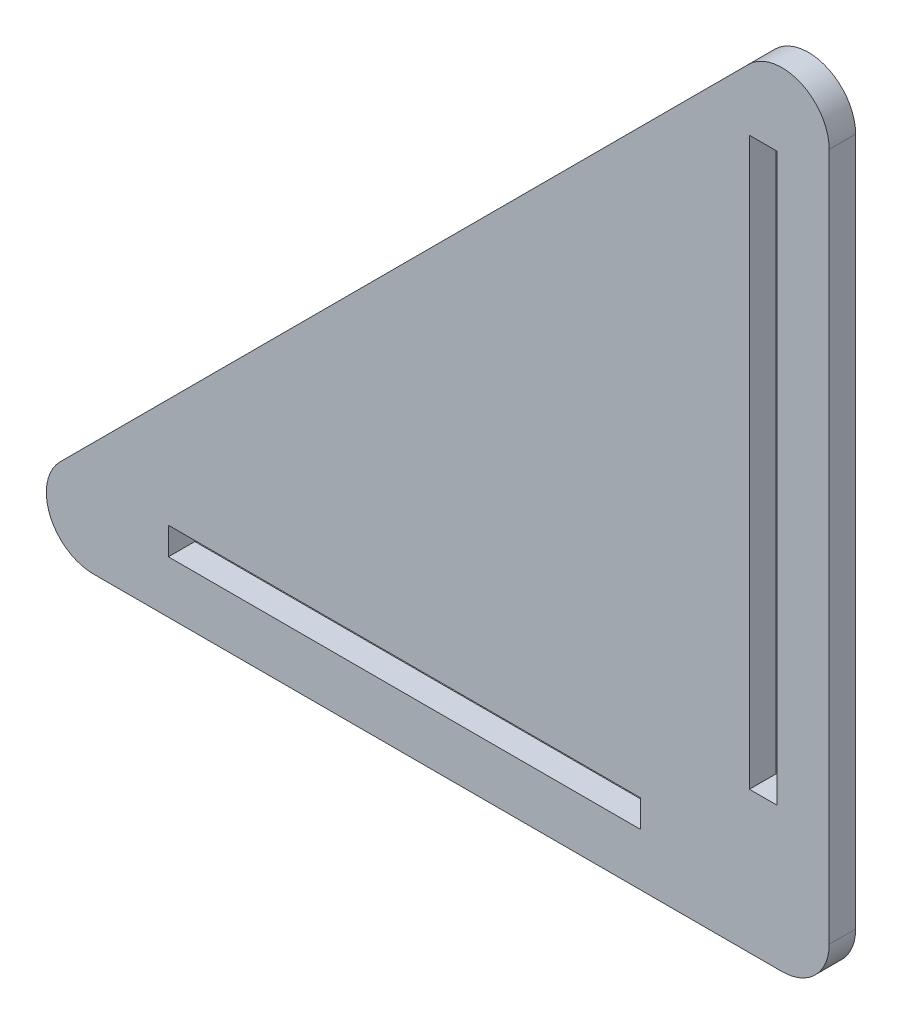
ISO-10303-21;
HEADER;
FILE_DESCRIPTION(('STEP AP214'),'2;1');
FILE_NAME('part.step','',(''),(''),'','','');
FILE_SCHEMA(('AUTOMOTIVE_DESIGN { 1 0 10303 214 1 1 1 1 }'));
ENDSEC;
DATA;
#1=APPLICATION_CONTEXT('core data for automotive mechanical design processes');
#2=APPLICATION_PROTOCOL_DEFINITION('international standard','automotive_design',2000,#1);
#3=PRODUCT_CONTEXT('',#1,'mechanical');
#4=PRODUCT('Part','Part','',(#3));
#5=PRODUCT_RELATED_PRODUCT_CATEGORY('part','',(#4));
#6=PRODUCT_DEFINITION_FORMATION('','',#4);
#7=PRODUCT_DEFINITION_CONTEXT('part definition',#1,'design');
#8=PRODUCT_DEFINITION('design','',#6,#7);
#9=PRODUCT_DEFINITION_SHAPE('','',#8);
#10=(LENGTH_UNIT() NAMED_UNIT(*) SI_UNIT(.MILLI.,.METRE.));
#11=(NAMED_UNIT(*) PLANE_ANGLE_UNIT() SI_UNIT($,.RADIAN.));
#12=(NAMED_UNIT(*) SI_UNIT($,.STERADIAN.) SOLID_ANGLE_UNIT());
#13=UNCERTAINTY_MEASURE_WITH_UNIT(LENGTH_MEASURE(1.E-05),#10,'distance_accuracy_value','');
#14=(GEOMETRIC_REPRESENTATION_CONTEXT(3) GLOBAL_UNCERTAINTY_ASSIGNED_CONTEXT((#13)) GLOBAL_UNIT_ASSIGNED_CONTEXT((#10,
#11,#12)) REPRESENTATION_CONTEXT('',''));
#15=CARTESIAN_POINT('',(0.,0.,0.));
#16=DIRECTION('',(0.,0.,1.));
#17=DIRECTION('',(1.,0.,0.));
#18=AXIS2_PLACEMENT_3D('',#15,#16,#17);
#19=CARTESIAN_POINT('',(40.,-40.,1.4));
#20=DIRECTION('',(0.,0.,1.));
#21=DIRECTION('',(1.,0.,0.));
#22=AXIS2_PLACEMENT_3D('',#19,#20,#21);
#23=PLANE('',#22);
#24=CARTESIAN_POINT('',(40.,-40.,1.4));
#25=DIRECTION('',(0.,0.,1.));
#26=DIRECTION('',(1.,0.,0.));
#27=AXIS2_PLACEMENT_3D('',#24,#25,#26);
#28=CIRCLE('',#27,4.99999999999999);
#29=CARTESIAN_POINT('',(40.,-45.,1.4));
#30=VERTEX_POINT('',#29);
#31=CARTESIAN_POINT('',(45.,-40.,1.4));
#32=VERTEX_POINT('',#31);
#33=EDGE_CURVE('E232',#30,#32,#28,.T.);
#34=ORIENTED_EDGE('',*,*,#33,.T.);
#35=DIRECTION('',(0.,1.,0.));
#36=VECTOR('',#35,1.);
#37=CARTESIAN_POINT('',(45.,-40.,1.4));
#38=LINE('',#37,#36);
#39=CARTESIAN_POINT('',(45.,32.9289321881345,1.4));
#40=VERTEX_POINT('',#39);
#41=EDGE_CURVE('E236',#32,#40,#38,.T.);
#42=ORIENTED_EDGE('',*,*,#41,.T.);
#43=CARTESIAN_POINT('',(40.,32.9289321881345,1.4));
#44=DIRECTION('',(0.,0.,1.));
#45=DIRECTION('',(-1.,0.,0.));
#46=AXIS2_PLACEMENT_3D('',#43,#44,#45);
#47=CIRCLE('',#46,5.);
#48=CARTESIAN_POINT('',(36.4644660940673,36.4644660940673,1.4));
#49=VERTEX_POINT('',#48);
#50=EDGE_CURVE('E240',#40,#49,#47,.T.);
#51=ORIENTED_EDGE('',*,*,#50,.T.);
#52=DIRECTION('',(-0.707106781186547,-0.707106781186548,0.));
#53=VECTOR('',#52,1.);
#54=CARTESIAN_POINT('',(-36.4644660940673,-36.4644660940673,1.4));
#55=LINE('',#54,#53);
#56=CARTESIAN_POINT('',(-36.4644660940673,-36.4644660940673,1.4));
#57=VERTEX_POINT('',#56);
#58=EDGE_CURVE('E243',#49,#57,#55,.T.);
#59=ORIENTED_EDGE('',*,*,#58,.T.);
#60=CARTESIAN_POINT('',(-32.9289321881345,-40.,1.4));
#61=DIRECTION('',(0.,0.,1.));
#62=DIRECTION('',(-1.,0.,0.));
#63=AXIS2_PLACEMENT_3D('',#60,#61,#62);
#64=CIRCLE('',#63,5.);
#65=CARTESIAN_POINT('',(-32.9289321881345,-45.,1.4));
#66=VERTEX_POINT('',#65);
#67=EDGE_CURVE('E246',#57,#66,#64,.T.);
#68=ORIENTED_EDGE('',*,*,#67,.T.);
#69=DIRECTION('',(1.,0.,0.));
#70=VECTOR('',#69,1.);
#71=CARTESIAN_POINT('',(-32.9289321881345,-45.,1.4));
#72=LINE('',#71,#70);
#73=EDGE_CURVE('E249',#66,#30,#72,.T.);
#74=ORIENTED_EDGE('',*,*,#73,.T.);
#75=EDGE_LOOP('',(#34,#42,#51,#59,#68,#74));
#76=FACE_BOUND('',#75,.T.);
#77=DIRECTION('',(-1.,0.,0.));
#78=VECTOR('',#77,1.);
#79=CARTESIAN_POINT('',(36.55,30.,1.4));
#80=LINE('',#79,#78);
#81=CARTESIAN_POINT('',(39.45,30.,1.4));
#82=VERTEX_POINT('',#81);
#83=CARTESIAN_POINT('',(36.55,30.,1.4));
#84=VERTEX_POINT('',#83);
#85=EDGE_CURVE('E192',#82,#84,#80,.T.);
#86=ORIENTED_EDGE('',*,*,#85,.F.);
#87=DIRECTION('',(0.,1.,0.));
#88=VECTOR('',#87,1.);
#89=CARTESIAN_POINT('',(39.45,-30.,1.4));
#90=LINE('',#89,#88);
#91=CARTESIAN_POINT('',(39.45,-30.,1.4));
#92=VERTEX_POINT('',#91);
#93=EDGE_CURVE('E189',#92,#82,#90,.T.);
#94=ORIENTED_EDGE('',*,*,#93,.F.);
#95=DIRECTION('',(1.,0.,0.));
#96=VECTOR('',#95,1.);
#97=CARTESIAN_POINT('',(36.55,-30.,1.4));
#98=LINE('',#97,#96);
#99=CARTESIAN_POINT('',(36.55,-30.,1.4));
#100=VERTEX_POINT('',#99);
#101=EDGE_CURVE('E200',#100,#92,#98,.T.);
#102=ORIENTED_EDGE('',*,*,#101,.F.);
#103=DIRECTION('',(0.,-1.,0.));
#104=VECTOR('',#103,1.);
#105=CARTESIAN_POINT('',(36.55,-30.,1.4));
#106=LINE('',#105,#104);
#107=EDGE_CURVE('E196',#84,#100,#106,.T.);
#108=ORIENTED_EDGE('',*,*,#107,.F.);
#109=EDGE_LOOP('',(#86,#94,#102,#108));
#110=FACE_BOUND('',#109,.T.);
#111=DIRECTION('',(-1.,0.,0.));
#112=VECTOR('',#111,1.);
#113=CARTESIAN_POINT('',(-25.,-36.55,1.4));
#114=LINE('',#113,#112);
#115=CARTESIAN_POINT('',(25.,-36.55,1.4));
#116=VERTEX_POINT('',#115);
#117=CARTESIAN_POINT('',(-25.,-36.55,1.4));
#118=VERTEX_POINT('',#117);
#119=EDGE_CURVE('E150',#116,#118,#114,.T.);
#120=ORIENTED_EDGE('',*,*,#119,.F.);
#121=DIRECTION('',(0.,1.,0.));
#122=VECTOR('',#121,1.);
#123=CARTESIAN_POINT('',(25.,-39.45,1.4));
#124=LINE('',#123,#122);
#125=CARTESIAN_POINT('',(25.,-39.45,1.4));
#126=VERTEX_POINT('',#125);
#127=EDGE_CURVE('E141',#126,#116,#124,.T.);
#128=ORIENTED_EDGE('',*,*,#127,.F.);
#129=DIRECTION('',(1.,0.,0.));
#130=VECTOR('',#129,1.);
#131=CARTESIAN_POINT('',(-25.,-39.45,1.4));
#132=LINE('',#131,#130);
#133=CARTESIAN_POINT('',(-25.,-39.45,1.4));
#134=VERTEX_POINT('',#133);
#135=EDGE_CURVE('E167',#134,#126,#132,.T.);
#136=ORIENTED_EDGE('',*,*,#135,.F.);
#137=DIRECTION('',(0.,-1.,0.));
#138=VECTOR('',#137,1.);
#139=CARTESIAN_POINT('',(-25.,-39.45,1.4));
#140=LINE('',#139,#138);
#141=EDGE_CURVE('E163',#118,#134,#140,.T.);
#142=ORIENTED_EDGE('',*,*,#141,.F.);
#143=EDGE_LOOP('',(#120,#128,#136,#142));
#144=FACE_BOUND('',#143,.T.);
#145=ADVANCED_FACE('F39',(#76,#110,#144),#23,.T.);
#146=CARTESIAN_POINT('',(40.,-40.,-1.4));
#147=DIRECTION('',(0.,0.,1.));
#148=DIRECTION('',(1.,0.,0.));
#149=AXIS2_PLACEMENT_3D('',#146,#147,#148);
#150=PLANE('',#149);
#151=DIRECTION('',(0.,1.,0.));
#152=VECTOR('',#151,1.);
#153=CARTESIAN_POINT('',(39.45,-30.,-1.4));
#154=LINE('',#153,#152);
#155=CARTESIAN_POINT('',(39.45,-30.,-1.4));
#156=VERTEX_POINT('',#155);
#157=CARTESIAN_POINT('',(39.45,30.,-1.4));
#158=VERTEX_POINT('',#157);
#159=EDGE_CURVE('E159',#156,#158,#154,.T.);
#160=ORIENTED_EDGE('',*,*,#159,.T.);
#161=DIRECTION('',(-1.,0.,0.));
#162=VECTOR('',#161,1.);
#163=CARTESIAN_POINT('',(36.55,30.,-1.4));
#164=LINE('',#163,#162);
#165=CARTESIAN_POINT('',(36.55,30.,-1.4));
#166=VERTEX_POINT('',#165);
#167=EDGE_CURVE('E207',#158,#166,#164,.T.);
#168=ORIENTED_EDGE('',*,*,#167,.T.);
#169=DIRECTION('',(0.,-1.,0.));
#170=VECTOR('',#169,1.);
#171=CARTESIAN_POINT('',(36.55,-30.,-1.4));
#172=LINE('',#171,#170);
#173=CARTESIAN_POINT('',(36.55,-30.,-1.4));
#174=VERTEX_POINT('',#173);
#175=EDGE_CURVE('E211',#166,#174,#172,.T.);
#176=ORIENTED_EDGE('',*,*,#175,.T.);
#177=DIRECTION('',(1.,0.,0.));
#178=VECTOR('',#177,1.);
#179=CARTESIAN_POINT('',(36.55,-30.,-1.4));
#180=LINE('',#179,#178);
#181=EDGE_CURVE('E193',#174,#156,#180,.T.);
#182=ORIENTED_EDGE('',*,*,#181,.T.);
#183=EDGE_LOOP('',(#160,#168,#176,#182));
#184=FACE_BOUND('',#183,.T.);
#185=CARTESIAN_POINT('',(40.,-40.,-1.4));
#186=DIRECTION('',(0.,0.,1.));
#187=DIRECTION('',(1.,0.,0.));
#188=AXIS2_PLACEMENT_3D('',#185,#186,#187);
#189=CIRCLE('',#188,4.99999999999999);
#190=CARTESIAN_POINT('',(40.,-45.,-1.4));
#191=VERTEX_POINT('',#190);
#192=CARTESIAN_POINT('',(45.,-40.,-1.4));
#193=VERTEX_POINT('',#192);
#194=EDGE_CURVE('E231',#191,#193,#189,.T.);
#195=ORIENTED_EDGE('',*,*,#194,.F.);
#196=DIRECTION('',(1.,0.,0.));
#197=VECTOR('',#196,1.);
#198=CARTESIAN_POINT('',(-32.9289321881345,-45.,-1.4));
#199=LINE('',#198,#197);
#200=CARTESIAN_POINT('',(-32.9289321881345,-45.,-1.4));
#201=VERTEX_POINT('',#200);
#202=EDGE_CURVE('E237',#201,#191,#199,.T.);
#203=ORIENTED_EDGE('',*,*,#202,.F.);
#204=CARTESIAN_POINT('',(-32.9289321881345,-40.,-1.4));
#205=DIRECTION('',(0.,0.,1.));
#206=DIRECTION('',(-1.,0.,0.));
#207=AXIS2_PLACEMENT_3D('',#204,#205,#206);
#208=CIRCLE('',#207,5.);
#209=CARTESIAN_POINT('',(-36.4644660940673,-36.4644660940673,-1.4));
#210=VERTEX_POINT('',#209);
#211=EDGE_CURVE('E265',#210,#201,#208,.T.);
#212=ORIENTED_EDGE('',*,*,#211,.F.);
#213=DIRECTION('',(-0.707106781186547,-0.707106781186548,0.));
#214=VECTOR('',#213,1.);
#215=CARTESIAN_POINT('',(-36.4644660940673,-36.4644660940673,-1.4));
#216=LINE('',#215,#214);
#217=CARTESIAN_POINT('',(36.4644660940673,36.4644660940673,-1.4));
#218=VERTEX_POINT('',#217);
#219=EDGE_CURVE('E262',#218,#210,#216,.T.);
#220=ORIENTED_EDGE('',*,*,#219,.F.);
#221=CARTESIAN_POINT('',(40.,32.9289321881345,-1.4));
#222=DIRECTION('',(0.,0.,1.));
#223=DIRECTION('',(-1.,0.,0.));
#224=AXIS2_PLACEMENT_3D('',#221,#222,#223);
#225=CIRCLE('',#224,5.);
#226=CARTESIAN_POINT('',(45.,32.9289321881345,-1.4));
#227=VERTEX_POINT('',#226);
#228=EDGE_CURVE('E259',#227,#218,#225,.T.);
#229=ORIENTED_EDGE('',*,*,#228,.F.);
#230=DIRECTION('',(0.,1.,0.));
#231=VECTOR('',#230,1.);
#232=CARTESIAN_POINT('',(45.,-40.,-1.4));
#233=LINE('',#232,#231);
#234=EDGE_CURVE('E256',#193,#227,#233,.T.);
#235=ORIENTED_EDGE('',*,*,#234,.F.);
#236=EDGE_LOOP('',(#195,#203,#212,#220,#229,#235));
#237=FACE_BOUND('',#236,.T.);
#238=DIRECTION('',(0.,1.,0.));
#239=VECTOR('',#238,1.);
#240=CARTESIAN_POINT('',(25.,-39.45,-1.4));
#241=LINE('',#240,#239);
#242=CARTESIAN_POINT('',(25.,-39.45,-1.4));
#243=VERTEX_POINT('',#242);
#244=CARTESIAN_POINT('',(25.,-36.55,-1.4));
#245=VERTEX_POINT('',#244);
#246=EDGE_CURVE('E63',#243,#245,#241,.T.);
#247=ORIENTED_EDGE('',*,*,#246,.T.);
#248=DIRECTION('',(-1.,0.,0.));
#249=VECTOR('',#248,1.);
#250=CARTESIAN_POINT('',(-25.,-36.55,-1.4));
#251=LINE('',#250,#249);
#252=CARTESIAN_POINT('',(-25.,-36.55,-1.4));
#253=VERTEX_POINT('',#252);
#254=EDGE_CURVE('E157',#245,#253,#251,.T.);
#255=ORIENTED_EDGE('',*,*,#254,.T.);
#256=DIRECTION('',(0.,-1.,0.));
#257=VECTOR('',#256,1.);
#258=CARTESIAN_POINT('',(-25.,-39.45,-1.4));
#259=LINE('',#258,#257);
#260=CARTESIAN_POINT('',(-25.,-39.45,-1.4));
#261=VERTEX_POINT('',#260);
#262=EDGE_CURVE('E176',#253,#261,#259,.T.);
#263=ORIENTED_EDGE('',*,*,#262,.T.);
#264=DIRECTION('',(1.,0.,0.));
#265=VECTOR('',#264,1.);
#266=CARTESIAN_POINT('',(-25.,-39.45,-1.4));
#267=LINE('',#266,#265);
#268=EDGE_CURVE('E151',#261,#243,#267,.T.);
#269=ORIENTED_EDGE('',*,*,#268,.T.);
#270=EDGE_LOOP('',(#247,#255,#263,#269));
#271=FACE_BOUND('',#270,.T.);
#272=ADVANCED_FACE('F296',(#184,#237,#271),#150,.F.);
#273=CARTESIAN_POINT('',(40.,-40.,1.4));
#274=DIRECTION('',(0.,0.,-1.));
#275=DIRECTION('',(-1.,0.,0.));
#276=AXIS2_PLACEMENT_3D('',#273,#274,#275);
#277=CYLINDRICAL_SURFACE('',#276,4.99999999999999);
#278=ORIENTED_EDGE('',*,*,#194,.T.);
#279=DIRECTION('',(0.,0.,-1.));
#280=VECTOR('',#279,1.);
#281=CARTESIAN_POINT('',(45.,-40.,1.4));
#282=LINE('',#281,#280);
#283=EDGE_CURVE('E11',#32,#193,#282,.T.);
#284=ORIENTED_EDGE('',*,*,#283,.F.);
#285=ORIENTED_EDGE('',*,*,#33,.F.);
#286=DIRECTION('',(0.,0.,-1.));
#287=VECTOR('',#286,1.);
#288=CARTESIAN_POINT('',(40.,-45.,1.4));
#289=LINE('',#288,#287);
#290=EDGE_CURVE('E252',#30,#191,#289,.T.);
#291=ORIENTED_EDGE('',*,*,#290,.T.);
#292=EDGE_LOOP('',(#278,#284,#285,#291));
#293=FACE_BOUND('',#292,.T.);
#294=ADVANCED_FACE('F41',(#293),#277,.T.);
#295=CARTESIAN_POINT('',(45.,-40.,1.4));
#296=DIRECTION('',(-1.,0.,0.));
#297=DIRECTION('',(0.,0.,1.));
#298=AXIS2_PLACEMENT_3D('',#295,#296,#297);
#299=PLANE('',#298);
#300=ORIENTED_EDGE('',*,*,#234,.T.);
#301=DIRECTION('',(0.,0.,-1.));
#302=VECTOR('',#301,1.);
#303=CARTESIAN_POINT('',(45.,32.9289321881345,1.4));
#304=LINE('',#303,#302);
#305=EDGE_CURVE('E48',#40,#227,#304,.T.);
#306=ORIENTED_EDGE('',*,*,#305,.F.);
#307=ORIENTED_EDGE('',*,*,#41,.F.);
#308=ORIENTED_EDGE('',*,*,#283,.T.);
#309=EDGE_LOOP('',(#300,#306,#307,#308));
#310=FACE_BOUND('',#309,.T.);
#311=ADVANCED_FACE('F314',(#310),#299,.F.);
#312=CARTESIAN_POINT('',(40.,32.9289321881345,1.4));
#313=DIRECTION('',(0.,0.,-1.));
#314=DIRECTION('',(-1.,0.,0.));
#315=AXIS2_PLACEMENT_3D('',#312,#313,#314);
#316=CYLINDRICAL_SURFACE('',#315,5.);
#317=ORIENTED_EDGE('',*,*,#228,.T.);
#318=DIRECTION('',(0.,0.,-1.));
#319=VECTOR('',#318,1.);
#320=CARTESIAN_POINT('',(36.4644660940673,36.4644660940673,1.4));
#321=LINE('',#320,#319);
#322=EDGE_CURVE('E281',#49,#218,#321,.T.);
#323=ORIENTED_EDGE('',*,*,#322,.F.);
#324=ORIENTED_EDGE('',*,*,#50,.F.);
#325=ORIENTED_EDGE('',*,*,#305,.T.);
#326=EDGE_LOOP('',(#317,#323,#324,#325));
#327=FACE_BOUND('',#326,.T.);
#328=ADVANCED_FACE('F290',(#327),#316,.T.);
#329=CARTESIAN_POINT('',(-36.4644660940673,-36.4644660940673,1.4));
#330=DIRECTION('',(0.707106781186548,-0.707106781186547,0.));
#331=DIRECTION('',(0.707106781186547,0.707106781186548,0.));
#332=AXIS2_PLACEMENT_3D('',#329,#330,#331);
#333=PLANE('',#332);
#334=ORIENTED_EDGE('',*,*,#219,.T.);
#335=DIRECTION('',(0.,0.,-1.));
#336=VECTOR('',#335,1.);
#337=CARTESIAN_POINT('',(-36.4644660940673,-36.4644660940673,1.4));
#338=LINE('',#337,#336);
#339=EDGE_CURVE('E277',#57,#210,#338,.T.);
#340=ORIENTED_EDGE('',*,*,#339,.F.);
#341=ORIENTED_EDGE('',*,*,#58,.F.);
#342=ORIENTED_EDGE('',*,*,#322,.T.);
#343=EDGE_LOOP('',(#334,#340,#341,#342));
#344=FACE_BOUND('',#343,.T.);
#345=ADVANCED_FACE('F302',(#344),#333,.F.);
#346=CARTESIAN_POINT('',(-32.9289321881345,-40.,1.4));
#347=DIRECTION('',(0.,0.,-1.));
#348=DIRECTION('',(-1.,0.,0.));
#349=AXIS2_PLACEMENT_3D('',#346,#347,#348);
#350=CYLINDRICAL_SURFACE('',#349,5.);
#351=ORIENTED_EDGE('',*,*,#211,.T.);
#352=DIRECTION('',(0.,0.,-1.));
#353=VECTOR('',#352,1.);
#354=CARTESIAN_POINT('',(-32.9289321881345,-45.,1.4));
#355=LINE('',#354,#353);
#356=EDGE_CURVE('E273',#66,#201,#355,.T.);
#357=ORIENTED_EDGE('',*,*,#356,.F.);
#358=ORIENTED_EDGE('',*,*,#67,.F.);
#359=ORIENTED_EDGE('',*,*,#339,.T.);
#360=EDGE_LOOP('',(#351,#357,#358,#359));
#361=FACE_BOUND('',#360,.T.);
#362=ADVANCED_FACE('F306',(#361),#350,.T.);
#363=CARTESIAN_POINT('',(-32.9289321881345,-45.,1.4));
#364=DIRECTION('',(0.,1.,0.));
#365=DIRECTION('',(0.,0.,1.));
#366=AXIS2_PLACEMENT_3D('',#363,#364,#365);
#367=PLANE('',#366);
#368=ORIENTED_EDGE('',*,*,#202,.T.);
#369=ORIENTED_EDGE('',*,*,#290,.F.);
#370=ORIENTED_EDGE('',*,*,#73,.F.);
#371=ORIENTED_EDGE('',*,*,#356,.T.);
#372=EDGE_LOOP('',(#368,#369,#370,#371));
#373=FACE_BOUND('',#372,.T.);
#374=ADVANCED_FACE('F317',(#373),#367,.F.);
#375=CARTESIAN_POINT('',(39.45,-30.,1.4));
#376=DIRECTION('',(-1.,0.,0.));
#377=DIRECTION('',(0.,0.,1.));
#378=AXIS2_PLACEMENT_3D('',#375,#376,#377);
#379=PLANE('',#378);
#380=ORIENTED_EDGE('',*,*,#159,.F.);
#381=DIRECTION('',(0.,0.,-1.));
#382=VECTOR('',#381,1.);
#383=CARTESIAN_POINT('',(39.45,-30.,1.4));
#384=LINE('',#383,#382);
#385=EDGE_CURVE('E203',#92,#156,#384,.T.);
#386=ORIENTED_EDGE('',*,*,#385,.F.);
#387=ORIENTED_EDGE('',*,*,#93,.T.);
#388=DIRECTION('',(0.,0.,-1.));
#389=VECTOR('',#388,1.);
#390=CARTESIAN_POINT('',(39.45,30.,1.4));
#391=LINE('',#390,#389);
#392=EDGE_CURVE('E227',#82,#158,#391,.T.);
#393=ORIENTED_EDGE('',*,*,#392,.T.);
#394=EDGE_LOOP('',(#380,#386,#387,#393));
#395=FACE_BOUND('',#394,.T.);
#396=ADVANCED_FACE('F319',(#395),#379,.T.);
#397=CARTESIAN_POINT('',(36.55,30.,1.4));
#398=DIRECTION('',(0.,-1.,0.));
#399=DIRECTION('',(0.,0.,-1.));
#400=AXIS2_PLACEMENT_3D('',#397,#398,#399);
#401=PLANE('',#400);
#402=ORIENTED_EDGE('',*,*,#167,.F.);
#403=ORIENTED_EDGE('',*,*,#392,.F.);
#404=ORIENTED_EDGE('',*,*,#85,.T.);
#405=DIRECTION('',(0.,0.,-1.));
#406=VECTOR('',#405,1.);
#407=CARTESIAN_POINT('',(36.55,30.,1.4));
#408=LINE('',#407,#406);
#409=EDGE_CURVE('E224',#84,#166,#408,.T.);
#410=ORIENTED_EDGE('',*,*,#409,.T.);
#411=EDGE_LOOP('',(#402,#403,#404,#410));
#412=FACE_BOUND('',#411,.T.);
#413=ADVANCED_FACE('F325',(#412),#401,.T.);
#414=CARTESIAN_POINT('',(36.55,-30.,1.4));
#415=DIRECTION('',(1.,0.,0.));
#416=DIRECTION('',(0.,0.,-1.));
#417=AXIS2_PLACEMENT_3D('',#414,#415,#416);
#418=PLANE('',#417);
#419=ORIENTED_EDGE('',*,*,#175,.F.);
#420=ORIENTED_EDGE('',*,*,#409,.F.);
#421=ORIENTED_EDGE('',*,*,#107,.T.);
#422=DIRECTION('',(0.,0.,-1.));
#423=VECTOR('',#422,1.);
#424=CARTESIAN_POINT('',(36.55,-30.,1.4));
#425=LINE('',#424,#423);
#426=EDGE_CURVE('E221',#100,#174,#425,.T.);
#427=ORIENTED_EDGE('',*,*,#426,.T.);
#428=EDGE_LOOP('',(#419,#420,#421,#427));
#429=FACE_BOUND('',#428,.T.);
#430=ADVANCED_FACE('F339',(#429),#418,.T.);
#431=CARTESIAN_POINT('',(36.55,-30.,1.4));
#432=DIRECTION('',(0.,1.,0.));
#433=DIRECTION('',(0.,0.,1.));
#434=AXIS2_PLACEMENT_3D('',#431,#432,#433);
#435=PLANE('',#434);
#436=ORIENTED_EDGE('',*,*,#181,.F.);
#437=ORIENTED_EDGE('',*,*,#426,.F.);
#438=ORIENTED_EDGE('',*,*,#101,.T.);
#439=ORIENTED_EDGE('',*,*,#385,.T.);
#440=EDGE_LOOP('',(#436,#437,#438,#439));
#441=FACE_BOUND('',#440,.T.);
#442=ADVANCED_FACE('F343',(#441),#435,.T.);
#443=CARTESIAN_POINT('',(25.,-39.45,1.4));
#444=DIRECTION('',(-1.,0.,0.));
#445=DIRECTION('',(0.,0.,1.));
#446=AXIS2_PLACEMENT_3D('',#443,#444,#445);
#447=PLANE('',#446);
#448=ORIENTED_EDGE('',*,*,#246,.F.);
#449=DIRECTION('',(0.,0.,-1.));
#450=VECTOR('',#449,1.);
#451=CARTESIAN_POINT('',(25.,-39.45,1.4));
#452=LINE('',#451,#450);
#453=EDGE_CURVE('E145',#126,#243,#452,.T.);
#454=ORIENTED_EDGE('',*,*,#453,.F.);
#455=ORIENTED_EDGE('',*,*,#127,.T.);
#456=DIRECTION('',(0.,0.,-1.));
#457=VECTOR('',#456,1.);
#458=CARTESIAN_POINT('',(25.,-36.55,1.4));
#459=LINE('',#458,#457);
#460=EDGE_CURVE('E144',#116,#245,#459,.T.);
#461=ORIENTED_EDGE('',*,*,#460,.T.);
#462=EDGE_LOOP('',(#448,#454,#455,#461));
#463=FACE_BOUND('',#462,.T.);
#464=ADVANCED_FACE('F143',(#463),#447,.T.);
#465=CARTESIAN_POINT('',(-25.,-36.55,1.4));
#466=DIRECTION('',(0.,-1.,0.));
#467=DIRECTION('',(0.,0.,-1.));
#468=AXIS2_PLACEMENT_3D('',#465,#466,#467);
#469=PLANE('',#468);
#470=ORIENTED_EDGE('',*,*,#254,.F.);
#471=ORIENTED_EDGE('',*,*,#460,.F.);
#472=ORIENTED_EDGE('',*,*,#119,.T.);
#473=DIRECTION('',(0.,0.,-1.));
#474=VECTOR('',#473,1.);
#475=CARTESIAN_POINT('',(-25.,-36.55,1.4));
#476=LINE('',#475,#474);
#477=EDGE_CURVE('E160',#118,#253,#476,.T.);
#478=ORIENTED_EDGE('',*,*,#477,.T.);
#479=EDGE_LOOP('',(#470,#471,#472,#478));
#480=FACE_BOUND('',#479,.T.);
#481=ADVANCED_FACE('F154',(#480),#469,.T.);
#482=CARTESIAN_POINT('',(-25.,-39.45,1.4));
#483=DIRECTION('',(1.,0.,0.));
#484=DIRECTION('',(0.,0.,-1.));
#485=AXIS2_PLACEMENT_3D('',#482,#483,#484);
#486=PLANE('',#485);
#487=ORIENTED_EDGE('',*,*,#262,.F.);
#488=ORIENTED_EDGE('',*,*,#477,.F.);
#489=ORIENTED_EDGE('',*,*,#141,.T.);
#490=DIRECTION('',(0.,0.,-1.));
#491=VECTOR('',#490,1.);
#492=CARTESIAN_POINT('',(-25.,-39.45,1.4));
#493=LINE('',#492,#491);
#494=EDGE_CURVE('E55',#134,#261,#493,.T.);
#495=ORIENTED_EDGE('',*,*,#494,.T.);
#496=EDGE_LOOP('',(#487,#488,#489,#495));
#497=FACE_BOUND('',#496,.T.);
#498=ADVANCED_FACE('F352',(#497),#486,.T.);
#499=CARTESIAN_POINT('',(-25.,-39.45,1.4));
#500=DIRECTION('',(0.,1.,0.));
#501=DIRECTION('',(0.,0.,1.));
#502=AXIS2_PLACEMENT_3D('',#499,#500,#501);
#503=PLANE('',#502);
#504=ORIENTED_EDGE('',*,*,#268,.F.);
#505=ORIENTED_EDGE('',*,*,#494,.F.);
#506=ORIENTED_EDGE('',*,*,#135,.T.);
#507=ORIENTED_EDGE('',*,*,#453,.T.);
#508=EDGE_LOOP('',(#504,#505,#506,#507));
#509=FACE_BOUND('',#508,.T.);
#510=ADVANCED_FACE('F355',(#509),#503,.T.);
#511=CLOSED_SHELL('',(#145,#272,#294,#311,#328,#345,#362,#374,#396,#413,#430,#442,#464,#481,
#498,#510));
#512=MANIFOLD_SOLID_BREP('B2',#511);
#513=ADVANCED_BREP_SHAPE_REPRESENTATION('',(#18,#512),#14);
#514=SHAPE_DEFINITION_REPRESENTATION(#9,#513);
ENDSEC;
END-ISO-10303-21;
